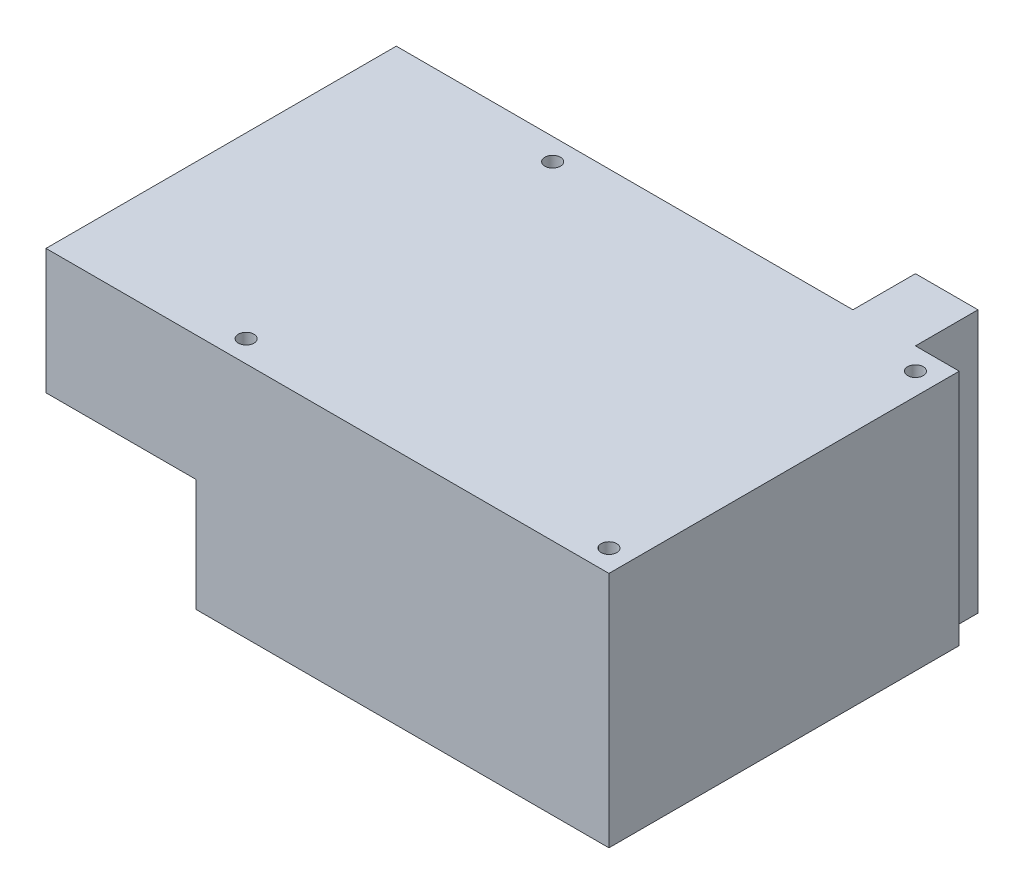
ISO-10303-21;
HEADER;
FILE_DESCRIPTION(('STEP AP214'),'2;1');
FILE_NAME('part.step','',(''),(''),'','','');
FILE_SCHEMA(('AUTOMOTIVE_DESIGN { 1 0 10303 214 1 1 1 1 }'));
ENDSEC;
DATA;
#1=APPLICATION_CONTEXT('core data for automotive mechanical design processes');
#2=APPLICATION_PROTOCOL_DEFINITION('international standard','automotive_design',2000,#1);
#3=PRODUCT_CONTEXT('',#1,'mechanical');
#4=PRODUCT('Part','Part','',(#3));
#5=PRODUCT_RELATED_PRODUCT_CATEGORY('part','',(#4));
#6=PRODUCT_DEFINITION_FORMATION('','',#4);
#7=PRODUCT_DEFINITION_CONTEXT('part definition',#1,'design');
#8=PRODUCT_DEFINITION('design','',#6,#7);
#9=PRODUCT_DEFINITION_SHAPE('','',#8);
#10=(LENGTH_UNIT() NAMED_UNIT(*) SI_UNIT(.MILLI.,.METRE.));
#11=(NAMED_UNIT(*) PLANE_ANGLE_UNIT() SI_UNIT($,.RADIAN.));
#12=(NAMED_UNIT(*) SI_UNIT($,.STERADIAN.) SOLID_ANGLE_UNIT());
#13=UNCERTAINTY_MEASURE_WITH_UNIT(LENGTH_MEASURE(1.E-05),#10,'distance_accuracy_value','');
#14=(GEOMETRIC_REPRESENTATION_CONTEXT(3) GLOBAL_UNCERTAINTY_ASSIGNED_CONTEXT((#13)) GLOBAL_UNIT_ASSIGNED_CONTEXT((#10,
#11,#12)) REPRESENTATION_CONTEXT('',''));
#15=CARTESIAN_POINT('',(0.,0.,0.));
#16=DIRECTION('',(0.,0.,1.));
#17=DIRECTION('',(1.,0.,0.));
#18=AXIS2_PLACEMENT_3D('',#15,#16,#17);
#19=CARTESIAN_POINT('',(-45.,20.,-28.));
#20=DIRECTION('',(0.,0.,1.));
#21=DIRECTION('',(1.,0.,0.));
#22=AXIS2_PLACEMENT_3D('',#19,#20,#21);
#23=PLANE('',#22);
#24=DIRECTION('',(0.,1.,0.));
#25=VECTOR('',#24,1.);
#26=CARTESIAN_POINT('',(28.,-22.,-28.));
#27=LINE('',#26,#25);
#28=CARTESIAN_POINT('',(28.,-18.,-28.));
#29=VERTEX_POINT('',#28);
#30=CARTESIAN_POINT('',(28.,20.,-28.));
#31=VERTEX_POINT('',#30);
#32=EDGE_CURVE('E11',#29,#31,#27,.T.);
#33=ORIENTED_EDGE('',*,*,#32,.F.);
#34=DIRECTION('',(1.,0.,0.));
#35=VECTOR('',#34,1.);
#36=CARTESIAN_POINT('',(-21.,-18.,-28.));
#37=LINE('',#36,#35);
#38=CARTESIAN_POINT('',(-21.,-18.,-28.));
#39=VERTEX_POINT('',#38);
#40=EDGE_CURVE('E183',#39,#29,#37,.T.);
#41=ORIENTED_EDGE('',*,*,#40,.F.);
#42=DIRECTION('',(0.,1.,0.));
#43=VECTOR('',#42,1.);
#44=CARTESIAN_POINT('',(-21.,-18.,-28.));
#45=LINE('',#44,#43);
#46=CARTESIAN_POINT('',(-21.,0.,-28.));
#47=VERTEX_POINT('',#46);
#48=EDGE_CURVE('E186',#39,#47,#45,.T.);
#49=ORIENTED_EDGE('',*,*,#48,.T.);
#50=DIRECTION('',(-1.,0.,0.));
#51=VECTOR('',#50,1.);
#52=CARTESIAN_POINT('',(-45.,0.,-28.));
#53=LINE('',#52,#51);
#54=CARTESIAN_POINT('',(-45.,0.,-28.));
#55=VERTEX_POINT('',#54);
#56=EDGE_CURVE('E194',#47,#55,#53,.T.);
#57=ORIENTED_EDGE('',*,*,#56,.T.);
#58=DIRECTION('',(0.,-1.,0.));
#59=VECTOR('',#58,1.);
#60=CARTESIAN_POINT('',(-45.,20.,-28.));
#61=LINE('',#60,#59);
#62=CARTESIAN_POINT('',(-45.,20.,-28.));
#63=VERTEX_POINT('',#62);
#64=EDGE_CURVE('E216',#63,#55,#61,.T.);
#65=ORIENTED_EDGE('',*,*,#64,.F.);
#66=DIRECTION('',(-1.,0.,0.));
#67=VECTOR('',#66,1.);
#68=CARTESIAN_POINT('',(-45.,20.,-28.));
#69=LINE('',#68,#67);
#70=EDGE_CURVE('E198',#31,#63,#69,.T.);
#71=ORIENTED_EDGE('',*,*,#70,.F.);
#72=EDGE_LOOP('',(#33,#41,#49,#57,#65,#71));
#73=FACE_BOUND('',#72,.T.);
#74=ADVANCED_FACE('F41',(#73),#23,.F.);
#75=CARTESIAN_POINT('',(45.,20.,28.));
#76=DIRECTION('',(-1.,0.,0.));
#77=DIRECTION('',(0.,0.,1.));
#78=AXIS2_PLACEMENT_3D('',#75,#76,#77);
#79=PLANE('',#78);
#80=DIRECTION('',(0.,-1.,0.));
#81=VECTOR('',#80,1.);
#82=CARTESIAN_POINT('',(45.,20.,28.));
#83=LINE('',#82,#81);
#84=CARTESIAN_POINT('',(45.,20.,28.));
#85=VERTEX_POINT('',#84);
#86=CARTESIAN_POINT('',(45.,-18.,28.));
#87=VERTEX_POINT('',#86);
#88=EDGE_CURVE('E207',#85,#87,#83,.T.);
#89=ORIENTED_EDGE('',*,*,#88,.T.);
#90=DIRECTION('',(0.,0.,1.));
#91=VECTOR('',#90,1.);
#92=CARTESIAN_POINT('',(45.,-18.,-28.));
#93=LINE('',#92,#91);
#94=CARTESIAN_POINT('',(45.,-18.,-28.));
#95=VERTEX_POINT('',#94);
#96=EDGE_CURVE('E175',#95,#87,#93,.T.);
#97=ORIENTED_EDGE('',*,*,#96,.F.);
#98=DIRECTION('',(0.,-1.,0.));
#99=VECTOR('',#98,1.);
#100=CARTESIAN_POINT('',(45.,20.,-28.));
#101=LINE('',#100,#99);
#102=CARTESIAN_POINT('',(45.,20.,-28.));
#103=VERTEX_POINT('',#102);
#104=EDGE_CURVE('E219',#103,#95,#101,.T.);
#105=ORIENTED_EDGE('',*,*,#104,.F.);
#106=DIRECTION('',(0.,0.,-1.));
#107=VECTOR('',#106,1.);
#108=CARTESIAN_POINT('',(45.,20.,28.));
#109=LINE('',#108,#107);
#110=EDGE_CURVE('E195',#85,#103,#109,.T.);
#111=ORIENTED_EDGE('',*,*,#110,.F.);
#112=EDGE_LOOP('',(#89,#97,#105,#111));
#113=FACE_BOUND('',#112,.T.);
#114=ADVANCED_FACE('F43',(#113),#79,.F.);
#115=CARTESIAN_POINT('',(38.,-18.,-28.));
#116=VERTEX_POINT('',#115);
#117=EDGE_CURVE('E182',#116,#95,#37,.T.);
#118=ORIENTED_EDGE('',*,*,#117,.F.);
#119=DIRECTION('',(0.,1.,0.));
#120=VECTOR('',#119,1.);
#121=CARTESIAN_POINT('',(38.,-22.,-28.));
#122=LINE('',#121,#120);
#123=CARTESIAN_POINT('',(38.,20.,-28.));
#124=VERTEX_POINT('',#123);
#125=EDGE_CURVE('E50',#116,#124,#122,.T.);
#126=ORIENTED_EDGE('',*,*,#125,.T.);
#127=EDGE_CURVE('E200',#103,#124,#69,.T.);
#128=ORIENTED_EDGE('',*,*,#127,.F.);
#129=ORIENTED_EDGE('',*,*,#104,.T.);
#130=EDGE_LOOP('',(#118,#126,#128,#129));
#131=FACE_BOUND('',#130,.T.);
#132=ADVANCED_FACE('F283',(#131),#23,.F.);
#133=CARTESIAN_POINT('',(-45.,20.,28.));
#134=DIRECTION('',(1.,0.,0.));
#135=DIRECTION('',(0.,0.,-1.));
#136=AXIS2_PLACEMENT_3D('',#133,#134,#135);
#137=PLANE('',#136);
#138=DIRECTION('',(0.,0.,1.));
#139=VECTOR('',#138,1.);
#140=CARTESIAN_POINT('',(-45.,0.,28.));
#141=LINE('',#140,#139);
#142=CARTESIAN_POINT('',(-45.,0.,28.));
#143=VERTEX_POINT('',#142);
#144=EDGE_CURVE('E209',#55,#143,#141,.T.);
#145=ORIENTED_EDGE('',*,*,#144,.T.);
#146=DIRECTION('',(0.,-1.,0.));
#147=VECTOR('',#146,1.);
#148=CARTESIAN_POINT('',(-45.,20.,28.));
#149=LINE('',#148,#147);
#150=CARTESIAN_POINT('',(-45.,20.,28.));
#151=VERTEX_POINT('',#150);
#152=EDGE_CURVE('E213',#151,#143,#149,.T.);
#153=ORIENTED_EDGE('',*,*,#152,.F.);
#154=DIRECTION('',(0.,0.,1.));
#155=VECTOR('',#154,1.);
#156=CARTESIAN_POINT('',(-45.,20.,28.));
#157=LINE('',#156,#155);
#158=EDGE_CURVE('E203',#63,#151,#157,.T.);
#159=ORIENTED_EDGE('',*,*,#158,.F.);
#160=ORIENTED_EDGE('',*,*,#64,.T.);
#161=EDGE_LOOP('',(#145,#153,#159,#160));
#162=FACE_BOUND('',#161,.T.);
#163=ADVANCED_FACE('F290',(#162),#137,.F.);
#164=CARTESIAN_POINT('',(-45.,20.,28.));
#165=DIRECTION('',(0.,0.,-1.));
#166=DIRECTION('',(-1.,0.,0.));
#167=AXIS2_PLACEMENT_3D('',#164,#165,#166);
#168=PLANE('',#167);
#169=DIRECTION('',(1.,0.,0.));
#170=VECTOR('',#169,1.);
#171=CARTESIAN_POINT('',(-45.,0.,28.));
#172=LINE('',#171,#170);
#173=CARTESIAN_POINT('',(-21.,0.,28.));
#174=VERTEX_POINT('',#173);
#175=EDGE_CURVE('E199',#143,#174,#172,.T.);
#176=ORIENTED_EDGE('',*,*,#175,.T.);
#177=DIRECTION('',(0.,1.,0.));
#178=VECTOR('',#177,1.);
#179=CARTESIAN_POINT('',(-21.,-18.,28.));
#180=LINE('',#179,#178);
#181=CARTESIAN_POINT('',(-21.,-18.,28.));
#182=VERTEX_POINT('',#181);
#183=EDGE_CURVE('E191',#182,#174,#180,.T.);
#184=ORIENTED_EDGE('',*,*,#183,.F.);
#185=DIRECTION('',(-1.,0.,0.));
#186=VECTOR('',#185,1.);
#187=CARTESIAN_POINT('',(45.,-18.,28.));
#188=LINE('',#187,#186);
#189=EDGE_CURVE('E178',#87,#182,#188,.T.);
#190=ORIENTED_EDGE('',*,*,#189,.F.);
#191=ORIENTED_EDGE('',*,*,#88,.F.);
#192=DIRECTION('',(1.,0.,0.));
#193=VECTOR('',#192,1.);
#194=CARTESIAN_POINT('',(-45.,20.,28.));
#195=LINE('',#194,#193);
#196=EDGE_CURVE('E205',#151,#85,#195,.T.);
#197=ORIENTED_EDGE('',*,*,#196,.F.);
#198=ORIENTED_EDGE('',*,*,#152,.T.);
#199=EDGE_LOOP('',(#176,#184,#190,#191,#197,#198));
#200=FACE_BOUND('',#199,.T.);
#201=ADVANCED_FACE('F257',(#200),#168,.F.);
#202=CARTESIAN_POINT('',(0.,20.,0.));
#203=DIRECTION('',(0.,-1.,0.));
#204=DIRECTION('',(0.,0.,-1.));
#205=AXIS2_PLACEMENT_3D('',#202,#203,#204);
#206=PLANE('',#205);
#207=CARTESIAN_POINT('',(-16.5,20.,-24.5));
#208=DIRECTION('',(0.,1.,0.));
#209=DIRECTION('',(0.,0.,-1.));
#210=AXIS2_PLACEMENT_3D('',#207,#208,#209);
#211=CIRCLE('',#210,1.25);
#212=CARTESIAN_POINT('',(-16.5,20.,-25.75));
#213=VERTEX_POINT('',#212);
#214=EDGE_CURVE('E159',#213,#213,#211,.T.);
#215=ORIENTED_EDGE('',*,*,#214,.F.);
#216=EDGE_LOOP('',(#215));
#217=FACE_BOUND('',#216,.T.);
#218=CARTESIAN_POINT('',(-16.5,20.,24.5));
#219=DIRECTION('',(0.,1.,0.));
#220=DIRECTION('',(0.,0.,1.));
#221=AXIS2_PLACEMENT_3D('',#218,#219,#220);
#222=CIRCLE('',#221,1.25);
#223=CARTESIAN_POINT('',(-16.5,20.,25.75));
#224=VERTEX_POINT('',#223);
#225=EDGE_CURVE('E167',#224,#224,#222,.T.);
#226=ORIENTED_EDGE('',*,*,#225,.F.);
#227=EDGE_LOOP('',(#226));
#228=FACE_BOUND('',#227,.T.);
#229=CARTESIAN_POINT('',(41.5,20.,24.5));
#230=DIRECTION('',(0.,1.,0.));
#231=DIRECTION('',(0.,0.,-1.));
#232=AXIS2_PLACEMENT_3D('',#229,#230,#231);
#233=CIRCLE('',#232,1.25);
#234=CARTESIAN_POINT('',(41.5,20.,23.25));
#235=VERTEX_POINT('',#234);
#236=EDGE_CURVE('E163',#235,#235,#233,.T.);
#237=ORIENTED_EDGE('',*,*,#236,.F.);
#238=EDGE_LOOP('',(#237));
#239=FACE_BOUND('',#238,.T.);
#240=CARTESIAN_POINT('',(41.5,20.,-24.5));
#241=DIRECTION('',(0.,1.,0.));
#242=DIRECTION('',(0.,0.,1.));
#243=AXIS2_PLACEMENT_3D('',#240,#241,#242);
#244=CIRCLE('',#243,1.25);
#245=CARTESIAN_POINT('',(41.5,20.,-23.25));
#246=VERTEX_POINT('',#245);
#247=EDGE_CURVE('E166',#246,#246,#244,.T.);
#248=ORIENTED_EDGE('',*,*,#247,.F.);
#249=EDGE_LOOP('',(#248));
#250=FACE_BOUND('',#249,.T.);
#251=ORIENTED_EDGE('',*,*,#110,.T.);
#252=ORIENTED_EDGE('',*,*,#127,.T.);
#253=DIRECTION('',(0.,0.,-1.));
#254=VECTOR('',#253,1.);
#255=CARTESIAN_POINT('',(38.,20.,-28.));
#256=LINE('',#255,#254);
#257=CARTESIAN_POINT('',(38.,20.,-38.));
#258=VERTEX_POINT('',#257);
#259=EDGE_CURVE('E59',#124,#258,#256,.T.);
#260=ORIENTED_EDGE('',*,*,#259,.T.);
#261=DIRECTION('',(-1.,0.,0.));
#262=VECTOR('',#261,1.);
#263=CARTESIAN_POINT('',(38.,20.,-38.));
#264=LINE('',#263,#262);
#265=CARTESIAN_POINT('',(28.,20.,-38.));
#266=VERTEX_POINT('',#265);
#267=EDGE_CURVE('E151',#258,#266,#264,.T.);
#268=ORIENTED_EDGE('',*,*,#267,.T.);
#269=DIRECTION('',(0.,0.,1.));
#270=VECTOR('',#269,1.);
#271=CARTESIAN_POINT('',(28.,20.,-38.));
#272=LINE('',#271,#270);
#273=EDGE_CURVE('E148',#266,#31,#272,.T.);
#274=ORIENTED_EDGE('',*,*,#273,.T.);
#275=ORIENTED_EDGE('',*,*,#70,.T.);
#276=ORIENTED_EDGE('',*,*,#158,.T.);
#277=ORIENTED_EDGE('',*,*,#196,.T.);
#278=EDGE_LOOP('',(#251,#252,#260,#268,#274,#275,#276,#277));
#279=FACE_BOUND('',#278,.T.);
#280=ADVANCED_FACE('F270',(#217,#228,#239,#250,#279),#206,.F.);
#281=CARTESIAN_POINT('',(0.,0.,0.));
#282=DIRECTION('',(0.,-1.,0.));
#283=DIRECTION('',(0.,0.,-1.));
#284=AXIS2_PLACEMENT_3D('',#281,#282,#283);
#285=PLANE('',#284);
#286=DIRECTION('',(0.,0.,-1.));
#287=VECTOR('',#286,1.);
#288=CARTESIAN_POINT('',(-21.,0.,28.));
#289=LINE('',#288,#287);
#290=EDGE_CURVE('E67',#174,#47,#289,.T.);
#291=ORIENTED_EDGE('',*,*,#290,.F.);
#292=ORIENTED_EDGE('',*,*,#175,.F.);
#293=ORIENTED_EDGE('',*,*,#144,.F.);
#294=ORIENTED_EDGE('',*,*,#56,.F.);
#295=EDGE_LOOP('',(#291,#292,#293,#294));
#296=FACE_BOUND('',#295,.T.);
#297=ADVANCED_FACE('F300',(#296),#285,.T.);
#298=CARTESIAN_POINT('',(-21.,-18.,28.));
#299=DIRECTION('',(1.,0.,0.));
#300=DIRECTION('',(0.,0.,-1.));
#301=AXIS2_PLACEMENT_3D('',#298,#299,#300);
#302=PLANE('',#301);
#303=ORIENTED_EDGE('',*,*,#290,.T.);
#304=ORIENTED_EDGE('',*,*,#48,.F.);
#305=DIRECTION('',(0.,0.,-1.));
#306=VECTOR('',#305,1.);
#307=CARTESIAN_POINT('',(-21.,-18.,28.));
#308=LINE('',#307,#306);
#309=EDGE_CURVE('E180',#182,#39,#308,.T.);
#310=ORIENTED_EDGE('',*,*,#309,.F.);
#311=ORIENTED_EDGE('',*,*,#183,.T.);
#312=EDGE_LOOP('',(#303,#304,#310,#311));
#313=FACE_BOUND('',#312,.T.);
#314=ADVANCED_FACE('F240',(#313),#302,.F.);
#315=CARTESIAN_POINT('',(0.,-18.,0.));
#316=DIRECTION('',(0.,-1.,0.));
#317=DIRECTION('',(0.,0.,-1.));
#318=AXIS2_PLACEMENT_3D('',#315,#316,#317);
#319=PLANE('',#318);
#320=CARTESIAN_POINT('',(-16.5,-18.,-24.5));
#321=DIRECTION('',(0.,-1.,0.));
#322=DIRECTION('',(0.,0.,-1.));
#323=AXIS2_PLACEMENT_3D('',#320,#321,#322);
#324=CIRCLE('',#323,1.25);
#325=CARTESIAN_POINT('',(-16.5,-18.,-25.75));
#326=VERTEX_POINT('',#325);
#327=EDGE_CURVE('E45',#326,#326,#324,.T.);
#328=ORIENTED_EDGE('',*,*,#327,.F.);
#329=EDGE_LOOP('',(#328));
#330=FACE_BOUND('',#329,.T.);
#331=CARTESIAN_POINT('',(-16.5,-18.,24.5));
#332=DIRECTION('',(0.,-1.,0.));
#333=DIRECTION('',(0.,0.,-1.));
#334=AXIS2_PLACEMENT_3D('',#331,#332,#333);
#335=CIRCLE('',#334,1.25);
#336=CARTESIAN_POINT('',(-16.5,-18.,23.25));
#337=VERTEX_POINT('',#336);
#338=EDGE_CURVE('E226',#337,#337,#335,.T.);
#339=ORIENTED_EDGE('',*,*,#338,.F.);
#340=EDGE_LOOP('',(#339));
#341=FACE_BOUND('',#340,.T.);
#342=CARTESIAN_POINT('',(41.5,-18.,24.5));
#343=DIRECTION('',(0.,-1.,0.));
#344=DIRECTION('',(0.,0.,-1.));
#345=AXIS2_PLACEMENT_3D('',#342,#343,#344);
#346=CIRCLE('',#345,1.25);
#347=CARTESIAN_POINT('',(41.5,-18.,23.25));
#348=VERTEX_POINT('',#347);
#349=EDGE_CURVE('E224',#348,#348,#346,.T.);
#350=ORIENTED_EDGE('',*,*,#349,.F.);
#351=EDGE_LOOP('',(#350));
#352=FACE_BOUND('',#351,.T.);
#353=CARTESIAN_POINT('',(41.5,-18.,-24.5));
#354=DIRECTION('',(0.,-1.,0.));
#355=DIRECTION('',(0.,0.,-1.));
#356=AXIS2_PLACEMENT_3D('',#353,#354,#355);
#357=CIRCLE('',#356,1.25);
#358=CARTESIAN_POINT('',(41.5,-18.,-25.75));
#359=VERTEX_POINT('',#358);
#360=EDGE_CURVE('E174',#359,#359,#357,.T.);
#361=ORIENTED_EDGE('',*,*,#360,.F.);
#362=EDGE_LOOP('',(#361));
#363=FACE_BOUND('',#362,.T.);
#364=ORIENTED_EDGE('',*,*,#96,.T.);
#365=ORIENTED_EDGE('',*,*,#189,.T.);
#366=ORIENTED_EDGE('',*,*,#309,.T.);
#367=ORIENTED_EDGE('',*,*,#40,.T.);
#368=EDGE_CURVE('E187',#29,#116,#37,.T.);
#369=ORIENTED_EDGE('',*,*,#368,.T.);
#370=ORIENTED_EDGE('',*,*,#117,.T.);
#371=EDGE_LOOP('',(#364,#365,#366,#367,#369,#370));
#372=FACE_BOUND('',#371,.T.);
#373=ADVANCED_FACE('F236',(#330,#341,#352,#363,#372),#319,.T.);
#374=CARTESIAN_POINT('',(41.5,-40.,-24.5));
#375=DIRECTION('',(0.,1.,0.));
#376=DIRECTION('',(0.,0.,1.));
#377=AXIS2_PLACEMENT_3D('',#374,#375,#376);
#378=CYLINDRICAL_SURFACE('',#377,1.25);
#379=ORIENTED_EDGE('',*,*,#360,.T.);
#380=EDGE_LOOP('',(#379));
#381=FACE_BOUND('',#380,.T.);
#382=ORIENTED_EDGE('',*,*,#247,.T.);
#383=EDGE_LOOP('',(#382));
#384=FACE_BOUND('',#383,.T.);
#385=ADVANCED_FACE('F239',(#381,#384),#378,.F.);
#386=CARTESIAN_POINT('',(41.5,-40.,24.5));
#387=DIRECTION('',(0.,1.,0.));
#388=DIRECTION('',(0.,0.,1.));
#389=AXIS2_PLACEMENT_3D('',#386,#387,#388);
#390=CYLINDRICAL_SURFACE('',#389,1.25);
#391=ORIENTED_EDGE('',*,*,#349,.T.);
#392=EDGE_LOOP('',(#391));
#393=FACE_BOUND('',#392,.T.);
#394=ORIENTED_EDGE('',*,*,#236,.T.);
#395=EDGE_LOOP('',(#394));
#396=FACE_BOUND('',#395,.T.);
#397=ADVANCED_FACE('F363',(#393,#396),#390,.F.);
#398=CARTESIAN_POINT('',(-16.5,-40.,24.5));
#399=DIRECTION('',(0.,1.,0.));
#400=DIRECTION('',(0.,0.,1.));
#401=AXIS2_PLACEMENT_3D('',#398,#399,#400);
#402=CYLINDRICAL_SURFACE('',#401,1.25);
#403=ORIENTED_EDGE('',*,*,#338,.T.);
#404=EDGE_LOOP('',(#403));
#405=FACE_BOUND('',#404,.T.);
#406=ORIENTED_EDGE('',*,*,#225,.T.);
#407=EDGE_LOOP('',(#406));
#408=FACE_BOUND('',#407,.T.);
#409=ADVANCED_FACE('F372',(#405,#408),#402,.F.);
#410=CARTESIAN_POINT('',(-16.5,-40.,-24.5));
#411=DIRECTION('',(0.,1.,0.));
#412=DIRECTION('',(0.,0.,1.));
#413=AXIS2_PLACEMENT_3D('',#410,#411,#412);
#414=CYLINDRICAL_SURFACE('',#413,1.25);
#415=ORIENTED_EDGE('',*,*,#327,.T.);
#416=EDGE_LOOP('',(#415));
#417=FACE_BOUND('',#416,.T.);
#418=ORIENTED_EDGE('',*,*,#214,.T.);
#419=EDGE_LOOP('',(#418));
#420=FACE_BOUND('',#419,.T.);
#421=ADVANCED_FACE('F233',(#417,#420),#414,.F.);
#422=CARTESIAN_POINT('',(28.,-22.,-28.));
#423=DIRECTION('',(0.,0.,1.));
#424=DIRECTION('',(1.,0.,0.));
#425=AXIS2_PLACEMENT_3D('',#422,#423,#424);
#426=PLANE('',#425);
#427=ORIENTED_EDGE('',*,*,#368,.F.);
#428=CARTESIAN_POINT('',(28.,-22.,-28.));
#429=VERTEX_POINT('',#428);
#430=EDGE_CURVE('E52',#429,#29,#27,.T.);
#431=ORIENTED_EDGE('',*,*,#430,.F.);
#432=DIRECTION('',(1.,0.,0.));
#433=VECTOR('',#432,1.);
#434=CARTESIAN_POINT('',(28.,-22.,-28.));
#435=LINE('',#434,#433);
#436=CARTESIAN_POINT('',(38.,-22.,-28.));
#437=VERTEX_POINT('',#436);
#438=EDGE_CURVE('E141',#429,#437,#435,.T.);
#439=ORIENTED_EDGE('',*,*,#438,.T.);
#440=EDGE_CURVE('E126',#437,#116,#122,.T.);
#441=ORIENTED_EDGE('',*,*,#440,.T.);
#442=EDGE_LOOP('',(#427,#431,#439,#441));
#443=FACE_BOUND('',#442,.T.);
#444=ADVANCED_FACE('F146',(#443),#426,.T.);
#445=CARTESIAN_POINT('',(28.,-22.,-38.));
#446=DIRECTION('',(-1.,0.,0.));
#447=DIRECTION('',(0.,0.,1.));
#448=AXIS2_PLACEMENT_3D('',#445,#446,#447);
#449=PLANE('',#448);
#450=ORIENTED_EDGE('',*,*,#273,.F.);
#451=DIRECTION('',(0.,1.,0.));
#452=VECTOR('',#451,1.);
#453=CARTESIAN_POINT('',(28.,-22.,-38.));
#454=LINE('',#453,#452);
#455=CARTESIAN_POINT('',(28.,-22.,-38.));
#456=VERTEX_POINT('',#455);
#457=EDGE_CURVE('E160',#456,#266,#454,.T.);
#458=ORIENTED_EDGE('',*,*,#457,.F.);
#459=DIRECTION('',(0.,0.,1.));
#460=VECTOR('',#459,1.);
#461=CARTESIAN_POINT('',(28.,-22.,-38.));
#462=LINE('',#461,#460);
#463=EDGE_CURVE('E134',#456,#429,#462,.T.);
#464=ORIENTED_EDGE('',*,*,#463,.T.);
#465=ORIENTED_EDGE('',*,*,#430,.T.);
#466=ORIENTED_EDGE('',*,*,#32,.T.);
#467=EDGE_LOOP('',(#450,#458,#464,#465,#466));
#468=FACE_BOUND('',#467,.T.);
#469=ADVANCED_FACE('F268',(#468),#449,.T.);
#470=CARTESIAN_POINT('',(38.,-22.,-38.));
#471=DIRECTION('',(0.,0.,-1.));
#472=DIRECTION('',(-1.,0.,0.));
#473=AXIS2_PLACEMENT_3D('',#470,#471,#472);
#474=PLANE('',#473);
#475=ORIENTED_EDGE('',*,*,#267,.F.);
#476=DIRECTION('',(0.,1.,0.));
#477=VECTOR('',#476,1.);
#478=CARTESIAN_POINT('',(38.,-22.,-38.));
#479=LINE('',#478,#477);
#480=CARTESIAN_POINT('',(38.,-22.,-38.));
#481=VERTEX_POINT('',#480);
#482=EDGE_CURVE('E133',#481,#258,#479,.T.);
#483=ORIENTED_EDGE('',*,*,#482,.F.);
#484=DIRECTION('',(-1.,0.,0.));
#485=VECTOR('',#484,1.);
#486=CARTESIAN_POINT('',(38.,-22.,-38.));
#487=LINE('',#486,#485);
#488=EDGE_CURVE('E144',#481,#456,#487,.T.);
#489=ORIENTED_EDGE('',*,*,#488,.T.);
#490=ORIENTED_EDGE('',*,*,#457,.T.);
#491=EDGE_LOOP('',(#475,#483,#489,#490));
#492=FACE_BOUND('',#491,.T.);
#493=ADVANCED_FACE('F273',(#492),#474,.T.);
#494=CARTESIAN_POINT('',(38.,-22.,-28.));
#495=DIRECTION('',(1.,0.,0.));
#496=DIRECTION('',(0.,0.,-1.));
#497=AXIS2_PLACEMENT_3D('',#494,#495,#496);
#498=PLANE('',#497);
#499=ORIENTED_EDGE('',*,*,#259,.F.);
#500=ORIENTED_EDGE('',*,*,#125,.F.);
#501=ORIENTED_EDGE('',*,*,#440,.F.);
#502=DIRECTION('',(0.,0.,-1.));
#503=VECTOR('',#502,1.);
#504=CARTESIAN_POINT('',(38.,-22.,-28.));
#505=LINE('',#504,#503);
#506=EDGE_CURVE('E129',#437,#481,#505,.T.);
#507=ORIENTED_EDGE('',*,*,#506,.T.);
#508=ORIENTED_EDGE('',*,*,#482,.T.);
#509=EDGE_LOOP('',(#499,#500,#501,#507,#508));
#510=FACE_BOUND('',#509,.T.);
#511=ADVANCED_FACE('F128',(#510),#498,.T.);
#512=CARTESIAN_POINT('',(0.,-22.,0.));
#513=DIRECTION('',(0.,1.,0.));
#514=DIRECTION('',(0.,0.,1.));
#515=AXIS2_PLACEMENT_3D('',#512,#513,#514);
#516=PLANE('',#515);
#517=ORIENTED_EDGE('',*,*,#438,.F.);
#518=ORIENTED_EDGE('',*,*,#463,.F.);
#519=ORIENTED_EDGE('',*,*,#488,.F.);
#520=ORIENTED_EDGE('',*,*,#506,.F.);
#521=EDGE_LOOP('',(#517,#518,#519,#520));
#522=FACE_BOUND('',#521,.T.);
#523=ADVANCED_FACE('F139',(#522),#516,.F.);
#524=CLOSED_SHELL('',(#74,#114,#132,#163,#201,#280,#297,#314,#373,#385,#397,#409,#421,#444,#469,
#493,#511,#523));
#525=MANIFOLD_SOLID_BREP('B2',#524);
#526=ADVANCED_BREP_SHAPE_REPRESENTATION('',(#18,#525),#14);
#527=SHAPE_DEFINITION_REPRESENTATION(#9,#526);
ENDSEC;
END-ISO-10303-21;
